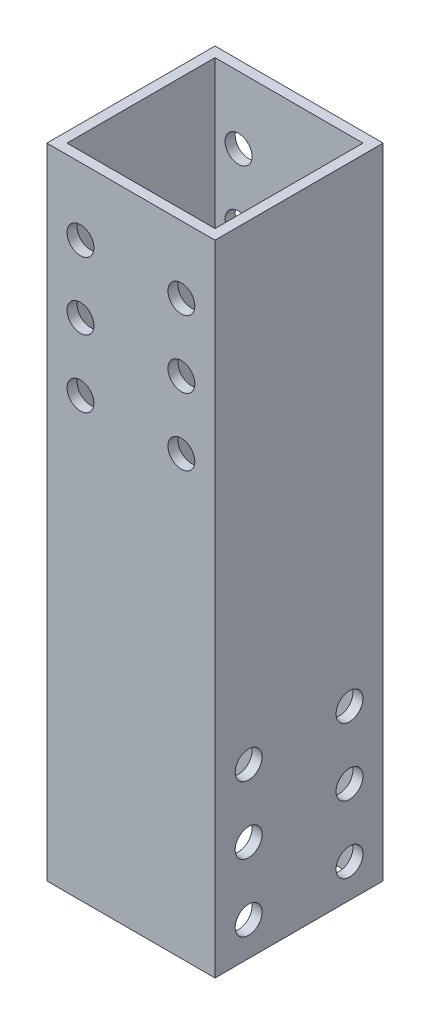
ISO-10303-21;
HEADER;
FILE_DESCRIPTION(('STEP AP214'),'2;1');
FILE_NAME('part.step','',(''),(''),'','','');
FILE_SCHEMA(('AUTOMOTIVE_DESIGN { 1 0 10303 214 1 1 1 1 }'));
ENDSEC;
DATA;
#1=APPLICATION_CONTEXT('core data for automotive mechanical design processes');
#2=APPLICATION_PROTOCOL_DEFINITION('international standard','automotive_design',2000,#1);
#3=PRODUCT_CONTEXT('',#1,'mechanical');
#4=PRODUCT('Part','Part','',(#3));
#5=PRODUCT_RELATED_PRODUCT_CATEGORY('part','',(#4));
#6=PRODUCT_DEFINITION_FORMATION('','',#4);
#7=PRODUCT_DEFINITION_CONTEXT('part definition',#1,'design');
#8=PRODUCT_DEFINITION('design','',#6,#7);
#9=PRODUCT_DEFINITION_SHAPE('','',#8);
#10=(LENGTH_UNIT() NAMED_UNIT(*) SI_UNIT(.MILLI.,.METRE.));
#11=(NAMED_UNIT(*) PLANE_ANGLE_UNIT() SI_UNIT($,.RADIAN.));
#12=(NAMED_UNIT(*) SI_UNIT($,.STERADIAN.) SOLID_ANGLE_UNIT());
#13=UNCERTAINTY_MEASURE_WITH_UNIT(LENGTH_MEASURE(1.E-05),#10,'distance_accuracy_value','');
#14=(GEOMETRIC_REPRESENTATION_CONTEXT(3) GLOBAL_UNCERTAINTY_ASSIGNED_CONTEXT((#13)) GLOBAL_UNIT_ASSIGNED_CONTEXT((#10,
#11,#12)) REPRESENTATION_CONTEXT('',''));
#15=CARTESIAN_POINT('',(0.,0.,0.));
#16=DIRECTION('',(0.,0.,1.));
#17=DIRECTION('',(1.,0.,0.));
#18=AXIS2_PLACEMENT_3D('',#15,#16,#17);
#19=CARTESIAN_POINT('',(12.5,-47.5,-12.5));
#20=DIRECTION('',(1.,0.,0.));
#21=DIRECTION('',(0.,0.,-1.));
#22=AXIS2_PLACEMENT_3D('',#19,#20,#21);
#23=PLANE('',#22);
#24=CARTESIAN_POINT('',(12.5,-22.5,-7.5));
#25=DIRECTION('',(1.,0.,0.));
#26=DIRECTION('',(0.,0.,-1.));
#27=AXIS2_PLACEMENT_3D('',#24,#25,#26);
#28=CIRCLE('',#27,2.);
#29=CARTESIAN_POINT('',(12.5,-22.5,-9.5));
#30=VERTEX_POINT('',#29);
#31=EDGE_CURVE('E238',#30,#30,#28,.T.);
#32=ORIENTED_EDGE('',*,*,#31,.F.);
#33=EDGE_LOOP('',(#32));
#34=FACE_BOUND('',#33,.T.);
#35=CARTESIAN_POINT('',(12.5,-32.5,-7.5));
#36=DIRECTION('',(1.,0.,0.));
#37=DIRECTION('',(0.,0.,-1.));
#38=AXIS2_PLACEMENT_3D('',#35,#36,#37);
#39=CIRCLE('',#38,2.);
#40=CARTESIAN_POINT('',(12.5,-32.5,-9.5));
#41=VERTEX_POINT('',#40);
#42=EDGE_CURVE('E244',#41,#41,#39,.T.);
#43=ORIENTED_EDGE('',*,*,#42,.F.);
#44=EDGE_LOOP('',(#43));
#45=FACE_BOUND('',#44,.T.);
#46=CARTESIAN_POINT('',(12.5,-42.5,7.49999999999999));
#47=DIRECTION('',(1.,0.,0.));
#48=DIRECTION('',(0.,0.,-1.));
#49=AXIS2_PLACEMENT_3D('',#46,#47,#48);
#50=CIRCLE('',#49,2.00000000000001);
#51=CARTESIAN_POINT('',(12.5,-42.5,5.49999999999999));
#52=VERTEX_POINT('',#51);
#53=EDGE_CURVE('E250',#52,#52,#50,.T.);
#54=ORIENTED_EDGE('',*,*,#53,.F.);
#55=EDGE_LOOP('',(#54));
#56=FACE_BOUND('',#55,.T.);
#57=CARTESIAN_POINT('',(12.5,-22.5,7.5));
#58=DIRECTION('',(1.,0.,0.));
#59=DIRECTION('',(0.,0.,-1.));
#60=AXIS2_PLACEMENT_3D('',#57,#58,#59);
#61=CIRCLE('',#60,2.00000000000001);
#62=CARTESIAN_POINT('',(12.5,-22.5,5.49999999999999));
#63=VERTEX_POINT('',#62);
#64=EDGE_CURVE('E231',#63,#63,#61,.T.);
#65=ORIENTED_EDGE('',*,*,#64,.F.);
#66=EDGE_LOOP('',(#65));
#67=FACE_BOUND('',#66,.T.);
#68=CARTESIAN_POINT('',(12.5,-32.5,7.5));
#69=DIRECTION('',(1.,0.,0.));
#70=DIRECTION('',(0.,0.,-1.));
#71=AXIS2_PLACEMENT_3D('',#68,#69,#70);
#72=CIRCLE('',#71,2.);
#73=CARTESIAN_POINT('',(12.5,-32.5,5.49999999999999));
#74=VERTEX_POINT('',#73);
#75=EDGE_CURVE('E227',#74,#74,#72,.T.);
#76=ORIENTED_EDGE('',*,*,#75,.F.);
#77=EDGE_LOOP('',(#76));
#78=FACE_BOUND('',#77,.T.);
#79=CARTESIAN_POINT('',(12.5,-42.5,-7.50000000000001));
#80=DIRECTION('',(1.,0.,0.));
#81=DIRECTION('',(0.,0.,-1.));
#82=AXIS2_PLACEMENT_3D('',#79,#80,#81);
#83=CIRCLE('',#82,2.);
#84=CARTESIAN_POINT('',(12.5,-42.5,-9.50000000000001));
#85=VERTEX_POINT('',#84);
#86=EDGE_CURVE('E237',#85,#85,#83,.T.);
#87=ORIENTED_EDGE('',*,*,#86,.F.);
#88=EDGE_LOOP('',(#87));
#89=FACE_BOUND('',#88,.T.);
#90=DIRECTION('',(0.,1.,0.));
#91=VECTOR('',#90,1.);
#92=CARTESIAN_POINT('',(12.5,-47.5,-12.5));
#93=LINE('',#92,#91);
#94=CARTESIAN_POINT('',(12.5,-47.5,-12.5));
#95=VERTEX_POINT('',#94);
#96=CARTESIAN_POINT('',(12.5,47.5,-12.5));
#97=VERTEX_POINT('',#96);
#98=EDGE_CURVE('E164',#95,#97,#93,.T.);
#99=ORIENTED_EDGE('',*,*,#98,.T.);
#100=DIRECTION('',(0.,0.,-1.));
#101=VECTOR('',#100,1.);
#102=CARTESIAN_POINT('',(12.5,47.5,-12.5));
#103=LINE('',#102,#101);
#104=CARTESIAN_POINT('',(12.5,47.5,12.5));
#105=VERTEX_POINT('',#104);
#106=EDGE_CURVE('E132',#105,#97,#103,.T.);
#107=ORIENTED_EDGE('',*,*,#106,.F.);
#108=DIRECTION('',(0.,1.,0.));
#109=VECTOR('',#108,1.);
#110=CARTESIAN_POINT('',(12.5,-47.5,12.5));
#111=LINE('',#110,#109);
#112=CARTESIAN_POINT('',(12.5,-47.5,12.5));
#113=VERTEX_POINT('',#112);
#114=EDGE_CURVE('E11',#113,#105,#111,.T.);
#115=ORIENTED_EDGE('',*,*,#114,.F.);
#116=DIRECTION('',(0.,0.,-1.));
#117=VECTOR('',#116,1.);
#118=CARTESIAN_POINT('',(12.5,-47.5,-12.5));
#119=LINE('',#118,#117);
#120=EDGE_CURVE('E151',#113,#95,#119,.T.);
#121=ORIENTED_EDGE('',*,*,#120,.T.);
#122=EDGE_LOOP('',(#99,#107,#115,#121));
#123=FACE_BOUND('',#122,.T.);
#124=ADVANCED_FACE('F35',(#34,#45,#56,#67,#78,#89,#123),#23,.T.);
#125=CARTESIAN_POINT('',(-12.5,-47.5,12.5));
#126=DIRECTION('',(0.,0.,1.));
#127=DIRECTION('',(1.,0.,0.));
#128=AXIS2_PLACEMENT_3D('',#125,#126,#127);
#129=PLANE('',#128);
#130=CARTESIAN_POINT('',(7.5,27.5,12.5));
#131=DIRECTION('',(0.,0.,-1.));
#132=DIRECTION('',(-1.,0.,0.));
#133=AXIS2_PLACEMENT_3D('',#130,#131,#132);
#134=CIRCLE('',#133,2.);
#135=CARTESIAN_POINT('',(5.5,27.5,12.5));
#136=VERTEX_POINT('',#135);
#137=EDGE_CURVE('E584',#136,#136,#134,.T.);
#138=ORIENTED_EDGE('',*,*,#137,.T.);
#139=EDGE_LOOP('',(#138));
#140=FACE_BOUND('',#139,.T.);
#141=CARTESIAN_POINT('',(7.5,37.5,12.5));
#142=DIRECTION('',(0.,0.,-1.));
#143=DIRECTION('',(-1.,0.,0.));
#144=AXIS2_PLACEMENT_3D('',#141,#142,#143);
#145=CIRCLE('',#144,2.);
#146=CARTESIAN_POINT('',(5.5,37.5,12.5));
#147=VERTEX_POINT('',#146);
#148=EDGE_CURVE('E610',#147,#147,#145,.T.);
#149=ORIENTED_EDGE('',*,*,#148,.T.);
#150=EDGE_LOOP('',(#149));
#151=FACE_BOUND('',#150,.T.);
#152=CARTESIAN_POINT('',(7.5,17.5,12.5));
#153=DIRECTION('',(0.,0.,-1.));
#154=DIRECTION('',(-1.,0.,0.));
#155=AXIS2_PLACEMENT_3D('',#152,#153,#154);
#156=CIRCLE('',#155,2.);
#157=CARTESIAN_POINT('',(5.5,17.5,12.5));
#158=VERTEX_POINT('',#157);
#159=EDGE_CURVE('E609',#158,#158,#156,.T.);
#160=ORIENTED_EDGE('',*,*,#159,.T.);
#161=EDGE_LOOP('',(#160));
#162=FACE_BOUND('',#161,.T.);
#163=CARTESIAN_POINT('',(-7.5,27.5,12.5));
#164=DIRECTION('',(0.,0.,-1.));
#165=DIRECTION('',(-1.,0.,0.));
#166=AXIS2_PLACEMENT_3D('',#163,#164,#165);
#167=CIRCLE('',#166,2.);
#168=CARTESIAN_POINT('',(-9.5,27.5,12.5));
#169=VERTEX_POINT('',#168);
#170=EDGE_CURVE('E603',#169,#169,#167,.T.);
#171=ORIENTED_EDGE('',*,*,#170,.T.);
#172=EDGE_LOOP('',(#171));
#173=FACE_BOUND('',#172,.T.);
#174=CARTESIAN_POINT('',(-7.5,17.5,12.5));
#175=DIRECTION('',(0.,0.,-1.));
#176=DIRECTION('',(-1.,0.,0.));
#177=AXIS2_PLACEMENT_3D('',#174,#175,#176);
#178=CIRCLE('',#177,2.);
#179=CARTESIAN_POINT('',(-9.5,17.5,12.5));
#180=VERTEX_POINT('',#179);
#181=EDGE_CURVE('E621',#180,#180,#178,.T.);
#182=ORIENTED_EDGE('',*,*,#181,.T.);
#183=EDGE_LOOP('',(#182));
#184=FACE_BOUND('',#183,.T.);
#185=CARTESIAN_POINT('',(-7.5,37.5,12.5));
#186=DIRECTION('',(0.,0.,-1.));
#187=DIRECTION('',(-1.,0.,0.));
#188=AXIS2_PLACEMENT_3D('',#185,#186,#187);
#189=CIRCLE('',#188,2.);
#190=CARTESIAN_POINT('',(-9.5,37.5,12.5));
#191=VERTEX_POINT('',#190);
#192=EDGE_CURVE('E198',#191,#191,#189,.T.);
#193=ORIENTED_EDGE('',*,*,#192,.T.);
#194=EDGE_LOOP('',(#193));
#195=FACE_BOUND('',#194,.T.);
#196=ORIENTED_EDGE('',*,*,#114,.T.);
#197=DIRECTION('',(1.,0.,0.));
#198=VECTOR('',#197,1.);
#199=CARTESIAN_POINT('',(-12.5,47.5,12.5));
#200=LINE('',#199,#198);
#201=CARTESIAN_POINT('',(-12.5,47.5,12.5));
#202=VERTEX_POINT('',#201);
#203=EDGE_CURVE('E141',#202,#105,#200,.T.);
#204=ORIENTED_EDGE('',*,*,#203,.F.);
#205=DIRECTION('',(0.,1.,0.));
#206=VECTOR('',#205,1.);
#207=CARTESIAN_POINT('',(-12.5,-47.5,12.5));
#208=LINE('',#207,#206);
#209=CARTESIAN_POINT('',(-12.5,-47.5,12.5));
#210=VERTEX_POINT('',#209);
#211=EDGE_CURVE('E43',#210,#202,#208,.T.);
#212=ORIENTED_EDGE('',*,*,#211,.F.);
#213=DIRECTION('',(1.,0.,0.));
#214=VECTOR('',#213,1.);
#215=CARTESIAN_POINT('',(-12.5,-47.5,12.5));
#216=LINE('',#215,#214);
#217=EDGE_CURVE('E162',#210,#113,#216,.T.);
#218=ORIENTED_EDGE('',*,*,#217,.T.);
#219=EDGE_LOOP('',(#196,#204,#212,#218));
#220=FACE_BOUND('',#219,.T.);
#221=ADVANCED_FACE('F300',(#140,#151,#162,#173,#184,#195,#220),#129,.T.);
#222=CARTESIAN_POINT('',(-12.5,-47.5,-12.5));
#223=DIRECTION('',(-1.,0.,0.));
#224=DIRECTION('',(0.,0.,1.));
#225=AXIS2_PLACEMENT_3D('',#222,#223,#224);
#226=PLANE('',#225);
#227=CARTESIAN_POINT('',(-12.5,-22.5,-7.5));
#228=DIRECTION('',(1.,0.,0.));
#229=DIRECTION('',(0.,0.,-1.));
#230=AXIS2_PLACEMENT_3D('',#227,#228,#229);
#231=CIRCLE('',#230,2.);
#232=CARTESIAN_POINT('',(-12.5,-22.5,-9.5));
#233=VERTEX_POINT('',#232);
#234=EDGE_CURVE('E234',#233,#233,#231,.T.);
#235=ORIENTED_EDGE('',*,*,#234,.T.);
#236=EDGE_LOOP('',(#235));
#237=FACE_BOUND('',#236,.T.);
#238=CARTESIAN_POINT('',(-12.5,-32.5,-7.5));
#239=DIRECTION('',(1.,0.,0.));
#240=DIRECTION('',(0.,0.,-1.));
#241=AXIS2_PLACEMENT_3D('',#238,#239,#240);
#242=CIRCLE('',#241,2.);
#243=CARTESIAN_POINT('',(-12.5,-32.5,-9.5));
#244=VERTEX_POINT('',#243);
#245=EDGE_CURVE('E241',#244,#244,#242,.T.);
#246=ORIENTED_EDGE('',*,*,#245,.T.);
#247=EDGE_LOOP('',(#246));
#248=FACE_BOUND('',#247,.T.);
#249=CARTESIAN_POINT('',(-12.5,-42.5,7.49999999999999));
#250=DIRECTION('',(1.,0.,0.));
#251=DIRECTION('',(0.,0.,-1.));
#252=AXIS2_PLACEMENT_3D('',#249,#250,#251);
#253=CIRCLE('',#252,2.00000000000001);
#254=CARTESIAN_POINT('',(-12.5,-42.5,5.49999999999999));
#255=VERTEX_POINT('',#254);
#256=EDGE_CURVE('E247',#255,#255,#253,.T.);
#257=ORIENTED_EDGE('',*,*,#256,.T.);
#258=EDGE_LOOP('',(#257));
#259=FACE_BOUND('',#258,.T.);
#260=CARTESIAN_POINT('',(-12.5,-22.5,7.5));
#261=DIRECTION('',(1.,0.,0.));
#262=DIRECTION('',(0.,0.,-1.));
#263=AXIS2_PLACEMENT_3D('',#260,#261,#262);
#264=CIRCLE('',#263,2.00000000000001);
#265=CARTESIAN_POINT('',(-12.5,-22.5,5.49999999999999));
#266=VERTEX_POINT('',#265);
#267=EDGE_CURVE('E253',#266,#266,#264,.T.);
#268=ORIENTED_EDGE('',*,*,#267,.T.);
#269=EDGE_LOOP('',(#268));
#270=FACE_BOUND('',#269,.T.);
#271=CARTESIAN_POINT('',(-12.5,-32.5,7.5));
#272=DIRECTION('',(1.,0.,0.));
#273=DIRECTION('',(0.,0.,-1.));
#274=AXIS2_PLACEMENT_3D('',#271,#272,#273);
#275=CIRCLE('',#274,2.);
#276=CARTESIAN_POINT('',(-12.5,-32.5,5.49999999999999));
#277=VERTEX_POINT('',#276);
#278=EDGE_CURVE('E228',#277,#277,#275,.T.);
#279=ORIENTED_EDGE('',*,*,#278,.T.);
#280=EDGE_LOOP('',(#279));
#281=FACE_BOUND('',#280,.T.);
#282=CARTESIAN_POINT('',(-12.5,-42.5,-7.50000000000001));
#283=DIRECTION('',(1.,0.,0.));
#284=DIRECTION('',(0.,0.,-1.));
#285=AXIS2_PLACEMENT_3D('',#282,#283,#284);
#286=CIRCLE('',#285,2.);
#287=CARTESIAN_POINT('',(-12.5,-42.5,-9.50000000000001));
#288=VERTEX_POINT('',#287);
#289=EDGE_CURVE('E174',#288,#288,#286,.T.);
#290=ORIENTED_EDGE('',*,*,#289,.T.);
#291=EDGE_LOOP('',(#290));
#292=FACE_BOUND('',#291,.T.);
#293=ORIENTED_EDGE('',*,*,#211,.T.);
#294=DIRECTION('',(0.,0.,1.));
#295=VECTOR('',#294,1.);
#296=CARTESIAN_POINT('',(-12.5,47.5,-12.5));
#297=LINE('',#296,#295);
#298=CARTESIAN_POINT('',(-12.5,47.5,-12.5));
#299=VERTEX_POINT('',#298);
#300=EDGE_CURVE('E138',#299,#202,#297,.T.);
#301=ORIENTED_EDGE('',*,*,#300,.F.);
#302=DIRECTION('',(0.,1.,0.));
#303=VECTOR('',#302,1.);
#304=CARTESIAN_POINT('',(-12.5,-47.5,-12.5));
#305=LINE('',#304,#303);
#306=CARTESIAN_POINT('',(-12.5,-47.5,-12.5));
#307=VERTEX_POINT('',#306);
#308=EDGE_CURVE('E167',#307,#299,#305,.T.);
#309=ORIENTED_EDGE('',*,*,#308,.F.);
#310=DIRECTION('',(0.,0.,1.));
#311=VECTOR('',#310,1.);
#312=CARTESIAN_POINT('',(-12.5,-47.5,-12.5));
#313=LINE('',#312,#311);
#314=EDGE_CURVE('E159',#307,#210,#313,.T.);
#315=ORIENTED_EDGE('',*,*,#314,.T.);
#316=EDGE_LOOP('',(#293,#301,#309,#315));
#317=FACE_BOUND('',#316,.T.);
#318=ADVANCED_FACE('F305',(#237,#248,#259,#270,#281,#292,#317),#226,.T.);
#319=CARTESIAN_POINT('',(-12.5,-47.5,-12.5));
#320=DIRECTION('',(0.,0.,-1.));
#321=DIRECTION('',(-1.,0.,0.));
#322=AXIS2_PLACEMENT_3D('',#319,#320,#321);
#323=PLANE('',#322);
#324=CARTESIAN_POINT('',(7.5,27.5,-12.5));
#325=DIRECTION('',(0.,0.,-1.));
#326=DIRECTION('',(-1.,0.,0.));
#327=AXIS2_PLACEMENT_3D('',#324,#325,#326);
#328=CIRCLE('',#327,2.);
#329=CARTESIAN_POINT('',(5.5,27.5,-12.5));
#330=VERTEX_POINT('',#329);
#331=EDGE_CURVE('E618',#330,#330,#328,.T.);
#332=ORIENTED_EDGE('',*,*,#331,.F.);
#333=EDGE_LOOP('',(#332));
#334=FACE_BOUND('',#333,.T.);
#335=CARTESIAN_POINT('',(7.5,37.5,-12.5));
#336=DIRECTION('',(0.,0.,-1.));
#337=DIRECTION('',(-1.,0.,0.));
#338=AXIS2_PLACEMENT_3D('',#335,#336,#337);
#339=CIRCLE('',#338,2.);
#340=CARTESIAN_POINT('',(5.5,37.5,-12.5));
#341=VERTEX_POINT('',#340);
#342=EDGE_CURVE('E623',#341,#341,#339,.T.);
#343=ORIENTED_EDGE('',*,*,#342,.F.);
#344=EDGE_LOOP('',(#343));
#345=FACE_BOUND('',#344,.T.);
#346=CARTESIAN_POINT('',(7.5,17.5,-12.5));
#347=DIRECTION('',(0.,0.,-1.));
#348=DIRECTION('',(-1.,0.,0.));
#349=AXIS2_PLACEMENT_3D('',#346,#347,#348);
#350=CIRCLE('',#349,2.);
#351=CARTESIAN_POINT('',(5.5,17.5,-12.5));
#352=VERTEX_POINT('',#351);
#353=EDGE_CURVE('E606',#352,#352,#350,.T.);
#354=ORIENTED_EDGE('',*,*,#353,.F.);
#355=EDGE_LOOP('',(#354));
#356=FACE_BOUND('',#355,.T.);
#357=CARTESIAN_POINT('',(-7.5,27.5,-12.5));
#358=DIRECTION('',(0.,0.,-1.));
#359=DIRECTION('',(-1.,0.,0.));
#360=AXIS2_PLACEMENT_3D('',#357,#358,#359);
#361=CIRCLE('',#360,2.);
#362=CARTESIAN_POINT('',(-9.5,27.5,-12.5));
#363=VERTEX_POINT('',#362);
#364=EDGE_CURVE('E613',#363,#363,#361,.T.);
#365=ORIENTED_EDGE('',*,*,#364,.F.);
#366=EDGE_LOOP('',(#365));
#367=FACE_BOUND('',#366,.T.);
#368=CARTESIAN_POINT('',(-7.5,17.5,-12.5));
#369=DIRECTION('',(0.,0.,-1.));
#370=DIRECTION('',(-1.,0.,0.));
#371=AXIS2_PLACEMENT_3D('',#368,#369,#370);
#372=CIRCLE('',#371,2.);
#373=CARTESIAN_POINT('',(-9.5,17.5,-12.5));
#374=VERTEX_POINT('',#373);
#375=EDGE_CURVE('E628',#374,#374,#372,.T.);
#376=ORIENTED_EDGE('',*,*,#375,.F.);
#377=EDGE_LOOP('',(#376));
#378=FACE_BOUND('',#377,.T.);
#379=CARTESIAN_POINT('',(-7.5,37.5,-12.5));
#380=DIRECTION('',(0.,0.,-1.));
#381=DIRECTION('',(-1.,0.,0.));
#382=AXIS2_PLACEMENT_3D('',#379,#380,#381);
#383=CIRCLE('',#382,2.);
#384=CARTESIAN_POINT('',(-9.5,37.5,-12.5));
#385=VERTEX_POINT('',#384);
#386=EDGE_CURVE('E600',#385,#385,#383,.T.);
#387=ORIENTED_EDGE('',*,*,#386,.F.);
#388=EDGE_LOOP('',(#387));
#389=FACE_BOUND('',#388,.T.);
#390=ORIENTED_EDGE('',*,*,#308,.T.);
#391=DIRECTION('',(-1.,0.,0.));
#392=VECTOR('',#391,1.);
#393=CARTESIAN_POINT('',(-12.5,47.5,-12.5));
#394=LINE('',#393,#392);
#395=EDGE_CURVE('E135',#97,#299,#394,.T.);
#396=ORIENTED_EDGE('',*,*,#395,.F.);
#397=ORIENTED_EDGE('',*,*,#98,.F.);
#398=DIRECTION('',(-1.,0.,0.));
#399=VECTOR('',#398,1.);
#400=CARTESIAN_POINT('',(-12.5,-47.5,-12.5));
#401=LINE('',#400,#399);
#402=EDGE_CURVE('E156',#95,#307,#401,.T.);
#403=ORIENTED_EDGE('',*,*,#402,.T.);
#404=EDGE_LOOP('',(#390,#396,#397,#403));
#405=FACE_BOUND('',#404,.T.);
#406=ADVANCED_FACE('F322',(#334,#345,#356,#367,#378,#389,#405),#323,.T.);
#407=CARTESIAN_POINT('',(0.,-47.5,0.));
#408=DIRECTION('',(0.,1.,0.));
#409=DIRECTION('',(0.,0.,1.));
#410=AXIS2_PLACEMENT_3D('',#407,#408,#409);
#411=PLANE('',#410);
#412=DIRECTION('',(1.,0.,0.));
#413=VECTOR('',#412,1.);
#414=CARTESIAN_POINT('',(-11.,-47.5,11.));
#415=LINE('',#414,#413);
#416=CARTESIAN_POINT('',(-11.,-47.5,11.));
#417=VERTEX_POINT('',#416);
#418=CARTESIAN_POINT('',(11.,-47.5,11.));
#419=VERTEX_POINT('',#418);
#420=EDGE_CURVE('E112',#417,#419,#415,.T.);
#421=ORIENTED_EDGE('',*,*,#420,.T.);
#422=DIRECTION('',(0.,0.,-1.));
#423=VECTOR('',#422,1.);
#424=CARTESIAN_POINT('',(11.,-47.5,-11.));
#425=LINE('',#424,#423);
#426=CARTESIAN_POINT('',(11.,-47.5,-11.));
#427=VERTEX_POINT('',#426);
#428=EDGE_CURVE('E144',#419,#427,#425,.T.);
#429=ORIENTED_EDGE('',*,*,#428,.T.);
#430=DIRECTION('',(-1.,0.,0.));
#431=VECTOR('',#430,1.);
#432=CARTESIAN_POINT('',(-11.,-47.5,-11.));
#433=LINE('',#432,#431);
#434=CARTESIAN_POINT('',(-11.,-47.5,-11.));
#435=VERTEX_POINT('',#434);
#436=EDGE_CURVE('E107',#427,#435,#433,.T.);
#437=ORIENTED_EDGE('',*,*,#436,.T.);
#438=DIRECTION('',(0.,0.,1.));
#439=VECTOR('',#438,1.);
#440=CARTESIAN_POINT('',(-11.,-47.5,-11.));
#441=LINE('',#440,#439);
#442=EDGE_CURVE('E51',#435,#417,#441,.T.);
#443=ORIENTED_EDGE('',*,*,#442,.T.);
#444=EDGE_LOOP('',(#421,#429,#437,#443));
#445=FACE_BOUND('',#444,.T.);
#446=ORIENTED_EDGE('',*,*,#120,.F.);
#447=ORIENTED_EDGE('',*,*,#217,.F.);
#448=ORIENTED_EDGE('',*,*,#314,.F.);
#449=ORIENTED_EDGE('',*,*,#402,.F.);
#450=EDGE_LOOP('',(#446,#447,#448,#449));
#451=FACE_BOUND('',#450,.T.);
#452=ADVANCED_FACE('F330',(#445,#451),#411,.F.);
#453=CARTESIAN_POINT('',(11.,-47.5,-11.));
#454=DIRECTION('',(1.,0.,0.));
#455=DIRECTION('',(0.,0.,-1.));
#456=AXIS2_PLACEMENT_3D('',#453,#454,#455);
#457=PLANE('',#456);
#458=CARTESIAN_POINT('',(11.,-22.5,-7.5));
#459=DIRECTION('',(1.,0.,0.));
#460=DIRECTION('',(0.,0.,-1.));
#461=AXIS2_PLACEMENT_3D('',#458,#459,#460);
#462=CIRCLE('',#461,2.);
#463=CARTESIAN_POINT('',(11.,-22.5,-9.5));
#464=VERTEX_POINT('',#463);
#465=EDGE_CURVE('E121',#464,#464,#462,.T.);
#466=ORIENTED_EDGE('',*,*,#465,.T.);
#467=EDGE_LOOP('',(#466));
#468=FACE_BOUND('',#467,.T.);
#469=CARTESIAN_POINT('',(11.,-32.5,-7.5));
#470=DIRECTION('',(1.,0.,0.));
#471=DIRECTION('',(0.,0.,-1.));
#472=AXIS2_PLACEMENT_3D('',#469,#470,#471);
#473=CIRCLE('',#472,2.);
#474=CARTESIAN_POINT('',(11.,-32.5,-9.5));
#475=VERTEX_POINT('',#474);
#476=EDGE_CURVE('E190',#475,#475,#473,.T.);
#477=ORIENTED_EDGE('',*,*,#476,.T.);
#478=EDGE_LOOP('',(#477));
#479=FACE_BOUND('',#478,.T.);
#480=CARTESIAN_POINT('',(11.,-42.5,7.49999999999999));
#481=DIRECTION('',(1.,0.,0.));
#482=DIRECTION('',(0.,0.,-1.));
#483=AXIS2_PLACEMENT_3D('',#480,#481,#482);
#484=CIRCLE('',#483,2.00000000000001);
#485=CARTESIAN_POINT('',(11.,-42.5,5.49999999999999));
#486=VERTEX_POINT('',#485);
#487=EDGE_CURVE('E186',#486,#486,#484,.T.);
#488=ORIENTED_EDGE('',*,*,#487,.T.);
#489=EDGE_LOOP('',(#488));
#490=FACE_BOUND('',#489,.T.);
#491=CARTESIAN_POINT('',(11.,-22.5,7.5));
#492=DIRECTION('',(1.,0.,0.));
#493=DIRECTION('',(0.,0.,-1.));
#494=AXIS2_PLACEMENT_3D('',#491,#492,#493);
#495=CIRCLE('',#494,2.00000000000001);
#496=CARTESIAN_POINT('',(11.,-22.5,5.49999999999999));
#497=VERTEX_POINT('',#496);
#498=EDGE_CURVE('E182',#497,#497,#495,.T.);
#499=ORIENTED_EDGE('',*,*,#498,.T.);
#500=EDGE_LOOP('',(#499));
#501=FACE_BOUND('',#500,.T.);
#502=CARTESIAN_POINT('',(11.,-32.5,7.5));
#503=DIRECTION('',(1.,0.,0.));
#504=DIRECTION('',(0.,0.,-1.));
#505=AXIS2_PLACEMENT_3D('',#502,#503,#504);
#506=CIRCLE('',#505,2.);
#507=CARTESIAN_POINT('',(11.,-32.5,5.49999999999999));
#508=VERTEX_POINT('',#507);
#509=EDGE_CURVE('E178',#508,#508,#506,.T.);
#510=ORIENTED_EDGE('',*,*,#509,.T.);
#511=EDGE_LOOP('',(#510));
#512=FACE_BOUND('',#511,.T.);
#513=CARTESIAN_POINT('',(11.,-42.5,-7.50000000000001));
#514=DIRECTION('',(1.,0.,0.));
#515=DIRECTION('',(0.,0.,-1.));
#516=AXIS2_PLACEMENT_3D('',#513,#514,#515);
#517=CIRCLE('',#516,2.);
#518=CARTESIAN_POINT('',(11.,-42.5,-9.50000000000001));
#519=VERTEX_POINT('',#518);
#520=EDGE_CURVE('E173',#519,#519,#517,.T.);
#521=ORIENTED_EDGE('',*,*,#520,.T.);
#522=EDGE_LOOP('',(#521));
#523=FACE_BOUND('',#522,.T.);
#524=DIRECTION('',(0.,1.,0.));
#525=VECTOR('',#524,1.);
#526=CARTESIAN_POINT('',(11.,-47.5,11.));
#527=LINE('',#526,#525);
#528=CARTESIAN_POINT('',(11.,47.5,11.));
#529=VERTEX_POINT('',#528);
#530=EDGE_CURVE('E117',#419,#529,#527,.T.);
#531=ORIENTED_EDGE('',*,*,#530,.T.);
#532=DIRECTION('',(0.,0.,-1.));
#533=VECTOR('',#532,1.);
#534=CARTESIAN_POINT('',(11.,47.5,-11.));
#535=LINE('',#534,#533);
#536=CARTESIAN_POINT('',(11.,47.5,-11.));
#537=VERTEX_POINT('',#536);
#538=EDGE_CURVE('E115',#529,#537,#535,.T.);
#539=ORIENTED_EDGE('',*,*,#538,.T.);
#540=DIRECTION('',(0.,1.,0.));
#541=VECTOR('',#540,1.);
#542=CARTESIAN_POINT('',(11.,-47.5,-11.));
#543=LINE('',#542,#541);
#544=EDGE_CURVE('E100',#427,#537,#543,.T.);
#545=ORIENTED_EDGE('',*,*,#544,.F.);
#546=ORIENTED_EDGE('',*,*,#428,.F.);
#547=EDGE_LOOP('',(#531,#539,#545,#546));
#548=FACE_BOUND('',#547,.T.);
#549=ADVANCED_FACE('F116',(#468,#479,#490,#501,#512,#523,#548),#457,.F.);
#550=CARTESIAN_POINT('',(-11.,-47.5,11.));
#551=DIRECTION('',(0.,0.,1.));
#552=DIRECTION('',(1.,0.,0.));
#553=AXIS2_PLACEMENT_3D('',#550,#551,#552);
#554=PLANE('',#553);
#555=CARTESIAN_POINT('',(7.5,27.5,11.));
#556=DIRECTION('',(0.,0.,1.));
#557=DIRECTION('',(1.,0.,0.));
#558=AXIS2_PLACEMENT_3D('',#555,#556,#557);
#559=CIRCLE('',#558,2.);
#560=CARTESIAN_POINT('',(9.5,27.5,11.));
#561=VERTEX_POINT('',#560);
#562=EDGE_CURVE('E224',#561,#561,#559,.T.);
#563=ORIENTED_EDGE('',*,*,#562,.T.);
#564=EDGE_LOOP('',(#563));
#565=FACE_BOUND('',#564,.T.);
#566=CARTESIAN_POINT('',(7.5,37.5,11.));
#567=DIRECTION('',(0.,0.,1.));
#568=DIRECTION('',(1.,0.,0.));
#569=AXIS2_PLACEMENT_3D('',#566,#567,#568);
#570=CIRCLE('',#569,2.);
#571=CARTESIAN_POINT('',(9.5,37.5,11.));
#572=VERTEX_POINT('',#571);
#573=EDGE_CURVE('E212',#572,#572,#570,.T.);
#574=ORIENTED_EDGE('',*,*,#573,.T.);
#575=EDGE_LOOP('',(#574));
#576=FACE_BOUND('',#575,.T.);
#577=CARTESIAN_POINT('',(7.5,17.5,11.));
#578=DIRECTION('',(0.,0.,1.));
#579=DIRECTION('',(1.,0.,0.));
#580=AXIS2_PLACEMENT_3D('',#577,#578,#579);
#581=CIRCLE('',#580,2.);
#582=CARTESIAN_POINT('',(9.50000000000001,17.5,11.));
#583=VERTEX_POINT('',#582);
#584=EDGE_CURVE('E209',#583,#583,#581,.T.);
#585=ORIENTED_EDGE('',*,*,#584,.T.);
#586=EDGE_LOOP('',(#585));
#587=FACE_BOUND('',#586,.T.);
#588=CARTESIAN_POINT('',(-7.5,27.5,11.));
#589=DIRECTION('',(0.,0.,1.));
#590=DIRECTION('',(1.,0.,0.));
#591=AXIS2_PLACEMENT_3D('',#588,#589,#590);
#592=CIRCLE('',#591,2.);
#593=CARTESIAN_POINT('',(-5.5,27.5,11.));
#594=VERTEX_POINT('',#593);
#595=EDGE_CURVE('E206',#594,#594,#592,.T.);
#596=ORIENTED_EDGE('',*,*,#595,.T.);
#597=EDGE_LOOP('',(#596));
#598=FACE_BOUND('',#597,.T.);
#599=CARTESIAN_POINT('',(-7.5,17.5,11.));
#600=DIRECTION('',(0.,0.,1.));
#601=DIRECTION('',(1.,0.,0.));
#602=AXIS2_PLACEMENT_3D('',#599,#600,#601);
#603=CIRCLE('',#602,2.);
#604=CARTESIAN_POINT('',(-5.5,17.5,11.));
#605=VERTEX_POINT('',#604);
#606=EDGE_CURVE('E202',#605,#605,#603,.T.);
#607=ORIENTED_EDGE('',*,*,#606,.T.);
#608=EDGE_LOOP('',(#607));
#609=FACE_BOUND('',#608,.T.);
#610=CARTESIAN_POINT('',(-7.5,37.5,11.));
#611=DIRECTION('',(0.,0.,1.));
#612=DIRECTION('',(1.,0.,0.));
#613=AXIS2_PLACEMENT_3D('',#610,#611,#612);
#614=CIRCLE('',#613,2.);
#615=CARTESIAN_POINT('',(-5.5,37.5,11.));
#616=VERTEX_POINT('',#615);
#617=EDGE_CURVE('E197',#616,#616,#614,.T.);
#618=ORIENTED_EDGE('',*,*,#617,.T.);
#619=EDGE_LOOP('',(#618));
#620=FACE_BOUND('',#619,.T.);
#621=DIRECTION('',(0.,1.,0.));
#622=VECTOR('',#621,1.);
#623=CARTESIAN_POINT('',(-11.,-47.5,11.));
#624=LINE('',#623,#622);
#625=CARTESIAN_POINT('',(-11.,47.5,11.));
#626=VERTEX_POINT('',#625);
#627=EDGE_CURVE('E152',#417,#626,#624,.T.);
#628=ORIENTED_EDGE('',*,*,#627,.T.);
#629=DIRECTION('',(1.,0.,0.));
#630=VECTOR('',#629,1.);
#631=CARTESIAN_POINT('',(-11.,47.5,11.));
#632=LINE('',#631,#630);
#633=EDGE_CURVE('E127',#626,#529,#632,.T.);
#634=ORIENTED_EDGE('',*,*,#633,.T.);
#635=ORIENTED_EDGE('',*,*,#530,.F.);
#636=ORIENTED_EDGE('',*,*,#420,.F.);
#637=EDGE_LOOP('',(#628,#634,#635,#636));
#638=FACE_BOUND('',#637,.T.);
#639=ADVANCED_FACE('F346',(#565,#576,#587,#598,#609,#620,#638),#554,.F.);
#640=CARTESIAN_POINT('',(-11.,-47.5,-11.));
#641=DIRECTION('',(-1.,0.,0.));
#642=DIRECTION('',(0.,0.,1.));
#643=AXIS2_PLACEMENT_3D('',#640,#641,#642);
#644=PLANE('',#643);
#645=CARTESIAN_POINT('',(-11.,-22.5,-7.5));
#646=DIRECTION('',(-1.,0.,0.));
#647=DIRECTION('',(0.,0.,1.));
#648=AXIS2_PLACEMENT_3D('',#645,#646,#647);
#649=CIRCLE('',#648,2.);
#650=CARTESIAN_POINT('',(-11.,-22.5,-5.50000000000001));
#651=VERTEX_POINT('',#650);
#652=EDGE_CURVE('E191',#651,#651,#649,.T.);
#653=ORIENTED_EDGE('',*,*,#652,.T.);
#654=EDGE_LOOP('',(#653));
#655=FACE_BOUND('',#654,.T.);
#656=CARTESIAN_POINT('',(-11.,-32.5,-7.5));
#657=DIRECTION('',(-1.,0.,0.));
#658=DIRECTION('',(0.,0.,1.));
#659=AXIS2_PLACEMENT_3D('',#656,#657,#658);
#660=CIRCLE('',#659,2.);
#661=CARTESIAN_POINT('',(-11.,-32.5,-5.5));
#662=VERTEX_POINT('',#661);
#663=EDGE_CURVE('E187',#662,#662,#660,.T.);
#664=ORIENTED_EDGE('',*,*,#663,.T.);
#665=EDGE_LOOP('',(#664));
#666=FACE_BOUND('',#665,.T.);
#667=CARTESIAN_POINT('',(-11.,-42.5,7.49999999999999));
#668=DIRECTION('',(-1.,0.,0.));
#669=DIRECTION('',(0.,0.,1.));
#670=AXIS2_PLACEMENT_3D('',#667,#668,#669);
#671=CIRCLE('',#670,2.00000000000001);
#672=CARTESIAN_POINT('',(-11.,-42.5,9.5));
#673=VERTEX_POINT('',#672);
#674=EDGE_CURVE('E183',#673,#673,#671,.T.);
#675=ORIENTED_EDGE('',*,*,#674,.T.);
#676=EDGE_LOOP('',(#675));
#677=FACE_BOUND('',#676,.T.);
#678=CARTESIAN_POINT('',(-11.,-22.5,7.5));
#679=DIRECTION('',(-1.,0.,0.));
#680=DIRECTION('',(0.,0.,1.));
#681=AXIS2_PLACEMENT_3D('',#678,#679,#680);
#682=CIRCLE('',#681,2.00000000000001);
#683=CARTESIAN_POINT('',(-11.,-22.5,9.5));
#684=VERTEX_POINT('',#683);
#685=EDGE_CURVE('E179',#684,#684,#682,.T.);
#686=ORIENTED_EDGE('',*,*,#685,.T.);
#687=EDGE_LOOP('',(#686));
#688=FACE_BOUND('',#687,.T.);
#689=CARTESIAN_POINT('',(-11.,-32.5,7.5));
#690=DIRECTION('',(-1.,0.,0.));
#691=DIRECTION('',(0.,0.,1.));
#692=AXIS2_PLACEMENT_3D('',#689,#690,#691);
#693=CIRCLE('',#692,2.);
#694=CARTESIAN_POINT('',(-11.,-32.5,9.5));
#695=VERTEX_POINT('',#694);
#696=EDGE_CURVE('E175',#695,#695,#693,.T.);
#697=ORIENTED_EDGE('',*,*,#696,.T.);
#698=EDGE_LOOP('',(#697));
#699=FACE_BOUND('',#698,.T.);
#700=CARTESIAN_POINT('',(-11.,-42.5,-7.50000000000001));
#701=DIRECTION('',(-1.,0.,0.));
#702=DIRECTION('',(0.,0.,1.));
#703=AXIS2_PLACEMENT_3D('',#700,#701,#702);
#704=CIRCLE('',#703,2.);
#705=CARTESIAN_POINT('',(-11.,-42.5,-5.50000000000001));
#706=VERTEX_POINT('',#705);
#707=EDGE_CURVE('E170',#706,#706,#704,.T.);
#708=ORIENTED_EDGE('',*,*,#707,.T.);
#709=EDGE_LOOP('',(#708));
#710=FACE_BOUND('',#709,.T.);
#711=DIRECTION('',(0.,1.,0.));
#712=VECTOR('',#711,1.);
#713=CARTESIAN_POINT('',(-11.,-47.5,-11.));
#714=LINE('',#713,#712);
#715=CARTESIAN_POINT('',(-11.,47.5,-11.));
#716=VERTEX_POINT('',#715);
#717=EDGE_CURVE('E111',#435,#716,#714,.T.);
#718=ORIENTED_EDGE('',*,*,#717,.T.);
#719=DIRECTION('',(0.,0.,1.));
#720=VECTOR('',#719,1.);
#721=CARTESIAN_POINT('',(-11.,47.5,-11.));
#722=LINE('',#721,#720);
#723=EDGE_CURVE('E125',#716,#626,#722,.T.);
#724=ORIENTED_EDGE('',*,*,#723,.T.);
#725=ORIENTED_EDGE('',*,*,#627,.F.);
#726=ORIENTED_EDGE('',*,*,#442,.F.);
#727=EDGE_LOOP('',(#718,#724,#725,#726));
#728=FACE_BOUND('',#727,.T.);
#729=ADVANCED_FACE('F349',(#655,#666,#677,#688,#699,#710,#728),#644,.F.);
#730=CARTESIAN_POINT('',(-11.,-47.5,-11.));
#731=DIRECTION('',(0.,0.,-1.));
#732=DIRECTION('',(-1.,0.,0.));
#733=AXIS2_PLACEMENT_3D('',#730,#731,#732);
#734=PLANE('',#733);
#735=CARTESIAN_POINT('',(7.5,27.5,-11.));
#736=DIRECTION('',(0.,0.,-1.));
#737=DIRECTION('',(-1.,0.,0.));
#738=AXIS2_PLACEMENT_3D('',#735,#736,#737);
#739=CIRCLE('',#738,2.);
#740=CARTESIAN_POINT('',(5.5,27.5,-11.));
#741=VERTEX_POINT('',#740);
#742=EDGE_CURVE('E38',#741,#741,#739,.T.);
#743=ORIENTED_EDGE('',*,*,#742,.T.);
#744=EDGE_LOOP('',(#743));
#745=FACE_BOUND('',#744,.T.);
#746=CARTESIAN_POINT('',(7.5,37.5,-11.));
#747=DIRECTION('',(0.,0.,-1.));
#748=DIRECTION('',(-1.,0.,0.));
#749=AXIS2_PLACEMENT_3D('',#746,#747,#748);
#750=CIRCLE('',#749,2.);
#751=CARTESIAN_POINT('',(5.5,37.5,-11.));
#752=VERTEX_POINT('',#751);
#753=EDGE_CURVE('E210',#752,#752,#750,.T.);
#754=ORIENTED_EDGE('',*,*,#753,.T.);
#755=EDGE_LOOP('',(#754));
#756=FACE_BOUND('',#755,.T.);
#757=CARTESIAN_POINT('',(7.5,17.5,-11.));
#758=DIRECTION('',(0.,0.,-1.));
#759=DIRECTION('',(-1.,0.,0.));
#760=AXIS2_PLACEMENT_3D('',#757,#758,#759);
#761=CIRCLE('',#760,2.);
#762=CARTESIAN_POINT('',(5.5,17.5,-11.));
#763=VERTEX_POINT('',#762);
#764=EDGE_CURVE('E207',#763,#763,#761,.T.);
#765=ORIENTED_EDGE('',*,*,#764,.T.);
#766=EDGE_LOOP('',(#765));
#767=FACE_BOUND('',#766,.T.);
#768=CARTESIAN_POINT('',(-7.5,27.5,-11.));
#769=DIRECTION('',(0.,0.,-1.));
#770=DIRECTION('',(-1.,0.,0.));
#771=AXIS2_PLACEMENT_3D('',#768,#769,#770);
#772=CIRCLE('',#771,2.);
#773=CARTESIAN_POINT('',(-9.5,27.5,-11.));
#774=VERTEX_POINT('',#773);
#775=EDGE_CURVE('E203',#774,#774,#772,.T.);
#776=ORIENTED_EDGE('',*,*,#775,.T.);
#777=EDGE_LOOP('',(#776));
#778=FACE_BOUND('',#777,.T.);
#779=CARTESIAN_POINT('',(-7.5,17.5,-11.));
#780=DIRECTION('',(0.,0.,-1.));
#781=DIRECTION('',(-1.,0.,0.));
#782=AXIS2_PLACEMENT_3D('',#779,#780,#781);
#783=CIRCLE('',#782,2.);
#784=CARTESIAN_POINT('',(-9.5,17.5,-11.));
#785=VERTEX_POINT('',#784);
#786=EDGE_CURVE('E199',#785,#785,#783,.T.);
#787=ORIENTED_EDGE('',*,*,#786,.T.);
#788=EDGE_LOOP('',(#787));
#789=FACE_BOUND('',#788,.T.);
#790=CARTESIAN_POINT('',(-7.5,37.5,-11.));
#791=DIRECTION('',(0.,0.,-1.));
#792=DIRECTION('',(-1.,0.,0.));
#793=AXIS2_PLACEMENT_3D('',#790,#791,#792);
#794=CIRCLE('',#793,2.);
#795=CARTESIAN_POINT('',(-9.5,37.5,-11.));
#796=VERTEX_POINT('',#795);
#797=EDGE_CURVE('E194',#796,#796,#794,.T.);
#798=ORIENTED_EDGE('',*,*,#797,.T.);
#799=EDGE_LOOP('',(#798));
#800=FACE_BOUND('',#799,.T.);
#801=ORIENTED_EDGE('',*,*,#544,.T.);
#802=DIRECTION('',(-1.,0.,0.));
#803=VECTOR('',#802,1.);
#804=CARTESIAN_POINT('',(-11.,47.5,-11.));
#805=LINE('',#804,#803);
#806=EDGE_CURVE('E104',#537,#716,#805,.T.);
#807=ORIENTED_EDGE('',*,*,#806,.T.);
#808=ORIENTED_EDGE('',*,*,#717,.F.);
#809=ORIENTED_EDGE('',*,*,#436,.F.);
#810=EDGE_LOOP('',(#801,#807,#808,#809));
#811=FACE_BOUND('',#810,.T.);
#812=ADVANCED_FACE('F102',(#745,#756,#767,#778,#789,#800,#811),#734,.F.);
#813=CARTESIAN_POINT('',(0.,47.5,0.));
#814=DIRECTION('',(0.,1.,0.));
#815=DIRECTION('',(0.,0.,1.));
#816=AXIS2_PLACEMENT_3D('',#813,#814,#815);
#817=PLANE('',#816);
#818=ORIENTED_EDGE('',*,*,#106,.T.);
#819=ORIENTED_EDGE('',*,*,#395,.T.);
#820=ORIENTED_EDGE('',*,*,#300,.T.);
#821=ORIENTED_EDGE('',*,*,#203,.T.);
#822=EDGE_LOOP('',(#818,#819,#820,#821));
#823=FACE_BOUND('',#822,.T.);
#824=ORIENTED_EDGE('',*,*,#806,.F.);
#825=ORIENTED_EDGE('',*,*,#538,.F.);
#826=ORIENTED_EDGE('',*,*,#633,.F.);
#827=ORIENTED_EDGE('',*,*,#723,.F.);
#828=EDGE_LOOP('',(#824,#825,#826,#827));
#829=FACE_BOUND('',#828,.T.);
#830=ADVANCED_FACE('F123',(#823,#829),#817,.T.);
#831=CARTESIAN_POINT('',(-12.5,-42.5,-7.50000000000001));
#832=DIRECTION('',(1.,0.,0.));
#833=DIRECTION('',(0.,0.,-1.));
#834=AXIS2_PLACEMENT_3D('',#831,#832,#833);
#835=CYLINDRICAL_SURFACE('',#834,2.);
#836=ORIENTED_EDGE('',*,*,#289,.F.);
#837=EDGE_LOOP('',(#836));
#838=FACE_BOUND('',#837,.T.);
#839=ORIENTED_EDGE('',*,*,#707,.F.);
#840=EDGE_LOOP('',(#839));
#841=FACE_BOUND('',#840,.T.);
#842=ADVANCED_FACE('F359',(#838,#841),#835,.F.);
#843=CARTESIAN_POINT('',(-12.5,-32.5,7.5));
#844=DIRECTION('',(1.,0.,0.));
#845=DIRECTION('',(0.,0.,-1.));
#846=AXIS2_PLACEMENT_3D('',#843,#844,#845);
#847=CYLINDRICAL_SURFACE('',#846,2.);
#848=ORIENTED_EDGE('',*,*,#278,.F.);
#849=EDGE_LOOP('',(#848));
#850=FACE_BOUND('',#849,.T.);
#851=ORIENTED_EDGE('',*,*,#696,.F.);
#852=EDGE_LOOP('',(#851));
#853=FACE_BOUND('',#852,.T.);
#854=ADVANCED_FACE('F382',(#850,#853),#847,.F.);
#855=CARTESIAN_POINT('',(-12.5,-22.5,7.5));
#856=DIRECTION('',(1.,0.,0.));
#857=DIRECTION('',(0.,0.,-1.));
#858=AXIS2_PLACEMENT_3D('',#855,#856,#857);
#859=CYLINDRICAL_SURFACE('',#858,2.00000000000001);
#860=ORIENTED_EDGE('',*,*,#267,.F.);
#861=EDGE_LOOP('',(#860));
#862=FACE_BOUND('',#861,.T.);
#863=ORIENTED_EDGE('',*,*,#685,.F.);
#864=EDGE_LOOP('',(#863));
#865=FACE_BOUND('',#864,.T.);
#866=ADVANCED_FACE('F368',(#862,#865),#859,.F.);
#867=CARTESIAN_POINT('',(-12.5,-42.5,7.49999999999999));
#868=DIRECTION('',(1.,0.,0.));
#869=DIRECTION('',(0.,0.,-1.));
#870=AXIS2_PLACEMENT_3D('',#867,#868,#869);
#871=CYLINDRICAL_SURFACE('',#870,2.00000000000001);
#872=ORIENTED_EDGE('',*,*,#256,.F.);
#873=EDGE_LOOP('',(#872));
#874=FACE_BOUND('',#873,.T.);
#875=ORIENTED_EDGE('',*,*,#674,.F.);
#876=EDGE_LOOP('',(#875));
#877=FACE_BOUND('',#876,.T.);
#878=ADVANCED_FACE('F371',(#874,#877),#871,.F.);
#879=CARTESIAN_POINT('',(-12.5,-32.5,-7.5));
#880=DIRECTION('',(1.,0.,0.));
#881=DIRECTION('',(0.,0.,-1.));
#882=AXIS2_PLACEMENT_3D('',#879,#880,#881);
#883=CYLINDRICAL_SURFACE('',#882,2.);
#884=ORIENTED_EDGE('',*,*,#245,.F.);
#885=EDGE_LOOP('',(#884));
#886=FACE_BOUND('',#885,.T.);
#887=ORIENTED_EDGE('',*,*,#663,.F.);
#888=EDGE_LOOP('',(#887));
#889=FACE_BOUND('',#888,.T.);
#890=ADVANCED_FACE('F294',(#886,#889),#883,.F.);
#891=CARTESIAN_POINT('',(-12.5,-22.5,-7.5));
#892=DIRECTION('',(1.,0.,0.));
#893=DIRECTION('',(0.,0.,-1.));
#894=AXIS2_PLACEMENT_3D('',#891,#892,#893);
#895=CYLINDRICAL_SURFACE('',#894,2.);
#896=ORIENTED_EDGE('',*,*,#234,.F.);
#897=EDGE_LOOP('',(#896));
#898=FACE_BOUND('',#897,.T.);
#899=ORIENTED_EDGE('',*,*,#652,.F.);
#900=EDGE_LOOP('',(#899));
#901=FACE_BOUND('',#900,.T.);
#902=ADVANCED_FACE('F282',(#898,#901),#895,.F.);
#903=ORIENTED_EDGE('',*,*,#86,.T.);
#904=EDGE_LOOP('',(#903));
#905=FACE_BOUND('',#904,.T.);
#906=ORIENTED_EDGE('',*,*,#520,.F.);
#907=EDGE_LOOP('',(#906));
#908=FACE_BOUND('',#907,.T.);
#909=ADVANCED_FACE('F297',(#905,#908),#835,.F.);
#910=ORIENTED_EDGE('',*,*,#75,.T.);
#911=EDGE_LOOP('',(#910));
#912=FACE_BOUND('',#911,.T.);
#913=ORIENTED_EDGE('',*,*,#509,.F.);
#914=EDGE_LOOP('',(#913));
#915=FACE_BOUND('',#914,.T.);
#916=ADVANCED_FACE('F362',(#912,#915),#847,.F.);
#917=ORIENTED_EDGE('',*,*,#64,.T.);
#918=EDGE_LOOP('',(#917));
#919=FACE_BOUND('',#918,.T.);
#920=ORIENTED_EDGE('',*,*,#498,.F.);
#921=EDGE_LOOP('',(#920));
#922=FACE_BOUND('',#921,.T.);
#923=ADVANCED_FACE('F364',(#919,#922),#859,.F.);
#924=ORIENTED_EDGE('',*,*,#53,.T.);
#925=EDGE_LOOP('',(#924));
#926=FACE_BOUND('',#925,.T.);
#927=ORIENTED_EDGE('',*,*,#487,.F.);
#928=EDGE_LOOP('',(#927));
#929=FACE_BOUND('',#928,.T.);
#930=ADVANCED_FACE('F291',(#926,#929),#871,.F.);
#931=ORIENTED_EDGE('',*,*,#42,.T.);
#932=EDGE_LOOP('',(#931));
#933=FACE_BOUND('',#932,.T.);
#934=ORIENTED_EDGE('',*,*,#476,.F.);
#935=EDGE_LOOP('',(#934));
#936=FACE_BOUND('',#935,.T.);
#937=ADVANCED_FACE('F279',(#933,#936),#883,.F.);
#938=ORIENTED_EDGE('',*,*,#31,.T.);
#939=EDGE_LOOP('',(#938));
#940=FACE_BOUND('',#939,.T.);
#941=ORIENTED_EDGE('',*,*,#465,.F.);
#942=EDGE_LOOP('',(#941));
#943=FACE_BOUND('',#942,.T.);
#944=ADVANCED_FACE('F276',(#940,#943),#895,.F.);
#945=CARTESIAN_POINT('',(-7.5,37.5,12.5));
#946=DIRECTION('',(0.,0.,-1.));
#947=DIRECTION('',(-1.,0.,0.));
#948=AXIS2_PLACEMENT_3D('',#945,#946,#947);
#949=CYLINDRICAL_SURFACE('',#948,2.);
#950=ORIENTED_EDGE('',*,*,#386,.T.);
#951=EDGE_LOOP('',(#950));
#952=FACE_BOUND('',#951,.T.);
#953=ORIENTED_EDGE('',*,*,#797,.F.);
#954=EDGE_LOOP('',(#953));
#955=FACE_BOUND('',#954,.T.);
#956=ADVANCED_FACE('F278',(#952,#955),#949,.F.);
#957=CARTESIAN_POINT('',(-7.5,17.5,12.5));
#958=DIRECTION('',(0.,0.,-1.));
#959=DIRECTION('',(-1.,0.,0.));
#960=AXIS2_PLACEMENT_3D('',#957,#958,#959);
#961=CYLINDRICAL_SURFACE('',#960,2.);
#962=ORIENTED_EDGE('',*,*,#375,.T.);
#963=EDGE_LOOP('',(#962));
#964=FACE_BOUND('',#963,.T.);
#965=ORIENTED_EDGE('',*,*,#786,.F.);
#966=EDGE_LOOP('',(#965));
#967=FACE_BOUND('',#966,.T.);
#968=ADVANCED_FACE('F287',(#964,#967),#961,.F.);
#969=CARTESIAN_POINT('',(-7.5,27.5,12.5));
#970=DIRECTION('',(0.,0.,-1.));
#971=DIRECTION('',(-1.,0.,0.));
#972=AXIS2_PLACEMENT_3D('',#969,#970,#971);
#973=CYLINDRICAL_SURFACE('',#972,2.);
#974=ORIENTED_EDGE('',*,*,#364,.T.);
#975=EDGE_LOOP('',(#974));
#976=FACE_BOUND('',#975,.T.);
#977=ORIENTED_EDGE('',*,*,#775,.F.);
#978=EDGE_LOOP('',(#977));
#979=FACE_BOUND('',#978,.T.);
#980=ADVANCED_FACE('F484',(#976,#979),#973,.F.);
#981=CARTESIAN_POINT('',(7.5,17.5,12.5));
#982=DIRECTION('',(0.,0.,-1.));
#983=DIRECTION('',(-1.,0.,0.));
#984=AXIS2_PLACEMENT_3D('',#981,#982,#983);
#985=CYLINDRICAL_SURFACE('',#984,2.);
#986=ORIENTED_EDGE('',*,*,#353,.T.);
#987=EDGE_LOOP('',(#986));
#988=FACE_BOUND('',#987,.T.);
#989=ORIENTED_EDGE('',*,*,#764,.F.);
#990=EDGE_LOOP('',(#989));
#991=FACE_BOUND('',#990,.T.);
#992=ADVANCED_FACE('F495',(#988,#991),#985,.F.);
#993=CARTESIAN_POINT('',(7.5,37.5,12.5));
#994=DIRECTION('',(0.,0.,-1.));
#995=DIRECTION('',(-1.,0.,0.));
#996=AXIS2_PLACEMENT_3D('',#993,#994,#995);
#997=CYLINDRICAL_SURFACE('',#996,2.);
#998=ORIENTED_EDGE('',*,*,#342,.T.);
#999=EDGE_LOOP('',(#998));
#1000=FACE_BOUND('',#999,.T.);
#1001=ORIENTED_EDGE('',*,*,#753,.F.);
#1002=EDGE_LOOP('',(#1001));
#1003=FACE_BOUND('',#1002,.T.);
#1004=ADVANCED_FACE('F506',(#1000,#1003),#997,.F.);
#1005=CARTESIAN_POINT('',(7.5,27.5,12.5));
#1006=DIRECTION('',(0.,0.,-1.));
#1007=DIRECTION('',(-1.,0.,0.));
#1008=AXIS2_PLACEMENT_3D('',#1005,#1006,#1007);
#1009=CYLINDRICAL_SURFACE('',#1008,2.);
#1010=ORIENTED_EDGE('',*,*,#331,.T.);
#1011=EDGE_LOOP('',(#1010));
#1012=FACE_BOUND('',#1011,.T.);
#1013=ORIENTED_EDGE('',*,*,#742,.F.);
#1014=EDGE_LOOP('',(#1013));
#1015=FACE_BOUND('',#1014,.T.);
#1016=ADVANCED_FACE('F517',(#1012,#1015),#1009,.F.);
#1017=ORIENTED_EDGE('',*,*,#192,.F.);
#1018=EDGE_LOOP('',(#1017));
#1019=FACE_BOUND('',#1018,.T.);
#1020=ORIENTED_EDGE('',*,*,#617,.F.);
#1021=EDGE_LOOP('',(#1020));
#1022=FACE_BOUND('',#1021,.T.);
#1023=ADVANCED_FACE('F290',(#1019,#1022),#949,.F.);
#1024=ORIENTED_EDGE('',*,*,#181,.F.);
#1025=EDGE_LOOP('',(#1024));
#1026=FACE_BOUND('',#1025,.T.);
#1027=ORIENTED_EDGE('',*,*,#606,.F.);
#1028=EDGE_LOOP('',(#1027));
#1029=FACE_BOUND('',#1028,.T.);
#1030=ADVANCED_FACE('F487',(#1026,#1029),#961,.F.);
#1031=ORIENTED_EDGE('',*,*,#170,.F.);
#1032=EDGE_LOOP('',(#1031));
#1033=FACE_BOUND('',#1032,.T.);
#1034=ORIENTED_EDGE('',*,*,#595,.F.);
#1035=EDGE_LOOP('',(#1034));
#1036=FACE_BOUND('',#1035,.T.);
#1037=ADVANCED_FACE('F498',(#1033,#1036),#973,.F.);
#1038=ORIENTED_EDGE('',*,*,#159,.F.);
#1039=EDGE_LOOP('',(#1038));
#1040=FACE_BOUND('',#1039,.T.);
#1041=ORIENTED_EDGE('',*,*,#584,.F.);
#1042=EDGE_LOOP('',(#1041));
#1043=FACE_BOUND('',#1042,.T.);
#1044=ADVANCED_FACE('F509',(#1040,#1043),#985,.F.);
#1045=ORIENTED_EDGE('',*,*,#148,.F.);
#1046=EDGE_LOOP('',(#1045));
#1047=FACE_BOUND('',#1046,.T.);
#1048=ORIENTED_EDGE('',*,*,#573,.F.);
#1049=EDGE_LOOP('',(#1048));
#1050=FACE_BOUND('',#1049,.T.);
#1051=ADVANCED_FACE('F520',(#1047,#1050),#997,.F.);
#1052=ORIENTED_EDGE('',*,*,#137,.F.);
#1053=EDGE_LOOP('',(#1052));
#1054=FACE_BOUND('',#1053,.T.);
#1055=ORIENTED_EDGE('',*,*,#562,.F.);
#1056=EDGE_LOOP('',(#1055));
#1057=FACE_BOUND('',#1056,.T.);
#1058=ADVANCED_FACE('F530',(#1054,#1057),#1009,.F.);
#1059=CLOSED_SHELL('',(#124,#221,#318,#406,#452,#549,#639,#729,#812,#830,#842,#854,#866,#878,
#890,#902,#909,#916,#923,#930,#937,#944,#956,#968,#980,#992,#1004,#1016,#1023,#1030,#1037,#1044,
#1051,#1058));
#1060=MANIFOLD_SOLID_BREP('B2',#1059);
#1061=ADVANCED_BREP_SHAPE_REPRESENTATION('',(#18,#1060),#14);
#1062=SHAPE_DEFINITION_REPRESENTATION(#9,#1061);
ENDSEC;
END-ISO-10303-21;
